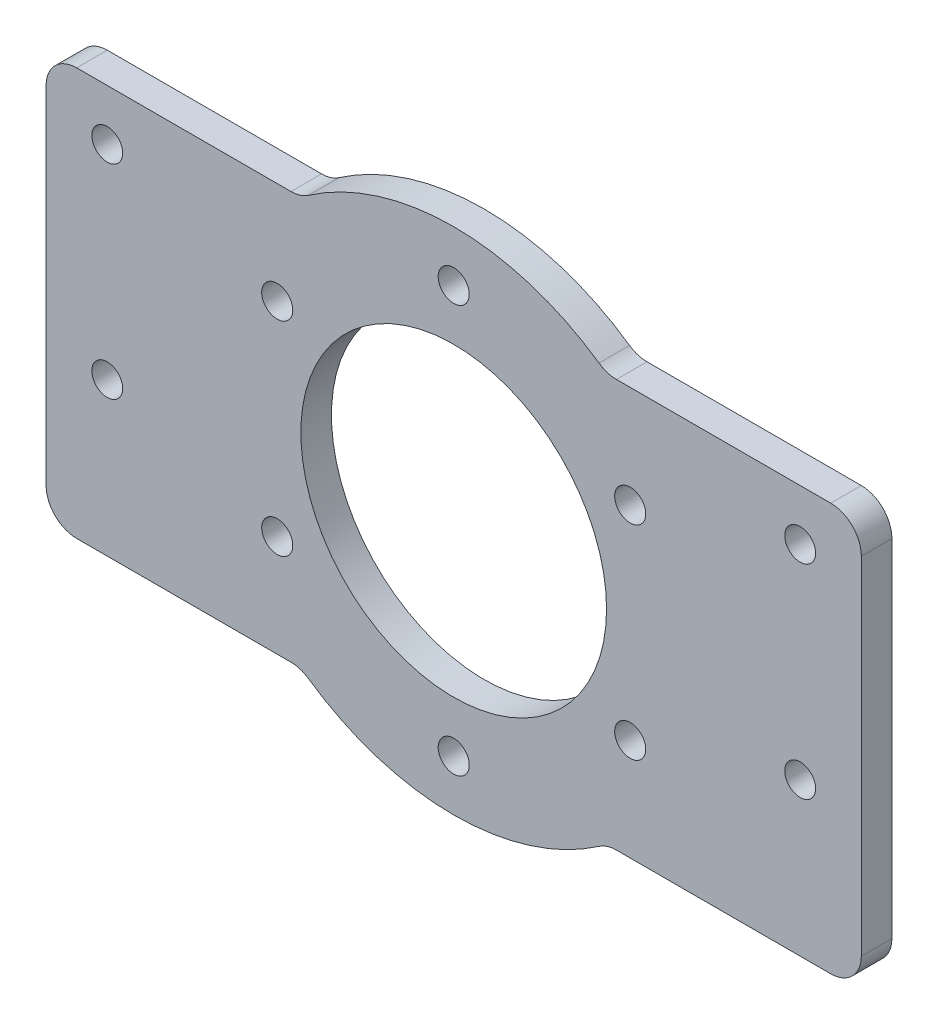
ISO-10303-21;
HEADER;
FILE_DESCRIPTION(('STEP AP214'),'2;1');
FILE_NAME('part.step','',(''),(''),'','','');
FILE_SCHEMA(('AUTOMOTIVE_DESIGN { 1 0 10303 214 1 1 1 1 }'));
ENDSEC;
DATA;
#1=APPLICATION_CONTEXT('core data for automotive mechanical design processes');
#2=APPLICATION_PROTOCOL_DEFINITION('international standard','automotive_design',2000,#1);
#3=PRODUCT_CONTEXT('',#1,'mechanical');
#4=PRODUCT('Part','Part','',(#3));
#5=PRODUCT_RELATED_PRODUCT_CATEGORY('part','',(#4));
#6=PRODUCT_DEFINITION_FORMATION('','',#4);
#7=PRODUCT_DEFINITION_CONTEXT('part definition',#1,'design');
#8=PRODUCT_DEFINITION('design','',#6,#7);
#9=PRODUCT_DEFINITION_SHAPE('','',#8);
#10=(LENGTH_UNIT() NAMED_UNIT(*) SI_UNIT(.MILLI.,.METRE.));
#11=(NAMED_UNIT(*) PLANE_ANGLE_UNIT() SI_UNIT($,.RADIAN.));
#12=(NAMED_UNIT(*) SI_UNIT($,.STERADIAN.) SOLID_ANGLE_UNIT());
#13=UNCERTAINTY_MEASURE_WITH_UNIT(LENGTH_MEASURE(1.E-05),#10,'distance_accuracy_value','');
#14=(GEOMETRIC_REPRESENTATION_CONTEXT(3) GLOBAL_UNCERTAINTY_ASSIGNED_CONTEXT((#13)) GLOBAL_UNIT_ASSIGNED_CONTEXT((#10,
#11,#12)) REPRESENTATION_CONTEXT('',''));
#15=CARTESIAN_POINT('',(0.,0.,0.));
#16=DIRECTION('',(0.,0.,1.));
#17=DIRECTION('',(1.,0.,0.));
#18=AXIS2_PLACEMENT_3D('',#15,#16,#17);
#19=CARTESIAN_POINT('',(0.,0.,3.));
#20=DIRECTION('',(0.,0.,-1.));
#21=DIRECTION('',(-1.,0.,0.));
#22=AXIS2_PLACEMENT_3D('',#19,#20,#21);
#23=CYLINDRICAL_SURFACE('',#22,25.);
#24=CARTESIAN_POINT('',(0.,0.,0.));
#25=DIRECTION('',(0.,0.,1.));
#26=DIRECTION('',(1.,0.,0.));
#27=AXIS2_PLACEMENT_3D('',#24,#25,#26);
#28=CIRCLE('',#27,25.);
#29=CARTESIAN_POINT('',(14.2577851988137,20.5357142857143,0.));
#30=VERTEX_POINT('',#29);
#31=CARTESIAN_POINT('',(-14.2577851988137,20.5357142857143,0.));
#32=VERTEX_POINT('',#31);
#33=EDGE_CURVE('E154',#30,#32,#28,.T.);
#34=ORIENTED_EDGE('',*,*,#33,.T.);
#35=DIRECTION('',(0.,0.,-1.));
#36=VECTOR('',#35,1.);
#37=CARTESIAN_POINT('',(-14.2577851988137,20.5357142857143,3.));
#38=LINE('',#37,#36);
#39=CARTESIAN_POINT('',(-14.2577851988137,20.5357142857143,3.));
#40=VERTEX_POINT('',#39);
#41=EDGE_CURVE('E160',#32,#40,#38,.F.);
#42=ORIENTED_EDGE('',*,*,#41,.T.);
#43=CARTESIAN_POINT('',(0.,0.,3.));
#44=DIRECTION('',(0.,0.,1.));
#45=DIRECTION('',(1.,0.,0.));
#46=AXIS2_PLACEMENT_3D('',#43,#44,#45);
#47=CIRCLE('',#46,25.);
#48=CARTESIAN_POINT('',(14.2577851988137,20.5357142857143,3.));
#49=VERTEX_POINT('',#48);
#50=EDGE_CURVE('E157',#49,#40,#47,.T.);
#51=ORIENTED_EDGE('',*,*,#50,.F.);
#52=DIRECTION('',(0.,0.,-1.));
#53=VECTOR('',#52,1.);
#54=CARTESIAN_POINT('',(14.2577851988137,20.5357142857143,3.));
#55=LINE('',#54,#53);
#56=EDGE_CURVE('E151',#49,#30,#55,.T.);
#57=ORIENTED_EDGE('',*,*,#56,.T.);
#58=EDGE_LOOP('',(#34,#42,#51,#57));
#59=FACE_BOUND('',#58,.T.);
#60=ADVANCED_FACE('F35',(#59),#23,.T.);
#61=CARTESIAN_POINT('',(0.,0.,3.));
#62=DIRECTION('',(0.,0.,1.));
#63=DIRECTION('',(1.,0.,0.));
#64=AXIS2_PLACEMENT_3D('',#61,#62,#63);
#65=PLANE('',#64);
#66=CARTESIAN_POINT('',(34.,15.,3.));
#67=DIRECTION('',(0.,0.,1.));
#68=DIRECTION('',(-1.,0.,0.));
#69=AXIS2_PLACEMENT_3D('',#66,#67,#68);
#70=CIRCLE('',#69,1.51499999999942);
#71=CARTESIAN_POINT('',(32.4850000000006,15.,3.));
#72=VERTEX_POINT('',#71);
#73=EDGE_CURVE('E582',#72,#72,#70,.T.);
#74=ORIENTED_EDGE('',*,*,#73,.F.);
#75=EDGE_LOOP('',(#74));
#76=FACE_BOUND('',#75,.T.);
#77=CARTESIAN_POINT('',(34.,-5.,3.));
#78=DIRECTION('',(0.,0.,1.));
#79=DIRECTION('',(-1.,0.,0.));
#80=AXIS2_PLACEMENT_3D('',#77,#78,#79);
#81=CIRCLE('',#80,1.51499999999942);
#82=CARTESIAN_POINT('',(32.4850000000006,-5.,3.));
#83=VERTEX_POINT('',#82);
#84=EDGE_CURVE('E583',#83,#83,#81,.T.);
#85=ORIENTED_EDGE('',*,*,#84,.F.);
#86=EDGE_LOOP('',(#85));
#87=FACE_BOUND('',#86,.T.);
#88=CARTESIAN_POINT('',(-34.,-5.,3.));
#89=DIRECTION('',(0.,0.,1.));
#90=DIRECTION('',(1.,0.,0.));
#91=AXIS2_PLACEMENT_3D('',#88,#89,#90);
#92=CIRCLE('',#91,1.51499999999942);
#93=CARTESIAN_POINT('',(-32.4850000000006,-5.,3.));
#94=VERTEX_POINT('',#93);
#95=EDGE_CURVE('E586',#94,#94,#92,.T.);
#96=ORIENTED_EDGE('',*,*,#95,.F.);
#97=EDGE_LOOP('',(#96));
#98=FACE_BOUND('',#97,.T.);
#99=CARTESIAN_POINT('',(-34.,15.,3.));
#100=DIRECTION('',(0.,0.,1.));
#101=DIRECTION('',(1.,0.,0.));
#102=AXIS2_PLACEMENT_3D('',#99,#100,#101);
#103=CIRCLE('',#102,1.51499999999942);
#104=CARTESIAN_POINT('',(-32.4850000000006,15.,3.));
#105=VERTEX_POINT('',#104);
#106=EDGE_CURVE('E189',#105,#105,#103,.T.);
#107=ORIENTED_EDGE('',*,*,#106,.F.);
#108=EDGE_LOOP('',(#107));
#109=FACE_BOUND('',#108,.T.);
#110=CARTESIAN_POINT('',(-17.3205080756888,9.99999999999998,3.));
#111=DIRECTION('',(0.,0.,1.));
#112=DIRECTION('',(1.,0.,0.));
#113=AXIS2_PLACEMENT_3D('',#110,#111,#112);
#114=CIRCLE('',#113,1.525);
#115=CARTESIAN_POINT('',(-15.7955080756888,9.99999999999998,3.));
#116=VERTEX_POINT('',#115);
#117=EDGE_CURVE('E240',#116,#116,#114,.T.);
#118=ORIENTED_EDGE('',*,*,#117,.F.);
#119=EDGE_LOOP('',(#118));
#120=FACE_BOUND('',#119,.T.);
#121=CARTESIAN_POINT('',(17.3205080756888,-9.99999999999999,3.));
#122=DIRECTION('',(0.,0.,1.));
#123=DIRECTION('',(1.,0.,0.));
#124=AXIS2_PLACEMENT_3D('',#121,#122,#123);
#125=CIRCLE('',#124,1.525);
#126=CARTESIAN_POINT('',(18.8455080756888,-9.99999999999999,3.));
#127=VERTEX_POINT('',#126);
#128=EDGE_CURVE('E252',#127,#127,#125,.T.);
#129=ORIENTED_EDGE('',*,*,#128,.F.);
#130=EDGE_LOOP('',(#129));
#131=FACE_BOUND('',#130,.T.);
#132=CARTESIAN_POINT('',(-17.3205080756888,-10.,3.));
#133=DIRECTION('',(0.,0.,1.));
#134=DIRECTION('',(1.,0.,0.));
#135=AXIS2_PLACEMENT_3D('',#132,#133,#134);
#136=CIRCLE('',#135,1.525);
#137=CARTESIAN_POINT('',(-15.7955080756888,-10.,3.));
#138=VERTEX_POINT('',#137);
#139=EDGE_CURVE('E264',#138,#138,#136,.T.);
#140=ORIENTED_EDGE('',*,*,#139,.F.);
#141=EDGE_LOOP('',(#140));
#142=FACE_BOUND('',#141,.T.);
#143=DIRECTION('',(-1.,0.,0.));
#144=VECTOR('',#143,1.);
#145=CARTESIAN_POINT('',(-40.,20.,3.));
#146=LINE('',#145,#144);
#147=CARTESIAN_POINT('',(-15.9687194226713,20.,3.));
#148=VERTEX_POINT('',#147);
#149=CARTESIAN_POINT('',(-37.,20.,3.));
#150=VERTEX_POINT('',#149);
#151=EDGE_CURVE('E205',#148,#150,#146,.T.);
#152=ORIENTED_EDGE('',*,*,#151,.T.);
#153=CARTESIAN_POINT('',(-37.,17.,3.));
#154=DIRECTION('',(0.,0.,1.));
#155=DIRECTION('',(1.,0.,0.));
#156=AXIS2_PLACEMENT_3D('',#153,#154,#155);
#157=CIRCLE('',#156,3.);
#158=CARTESIAN_POINT('',(-40.,17.,3.));
#159=VERTEX_POINT('',#158);
#160=EDGE_CURVE('E290',#150,#159,#157,.T.);
#161=ORIENTED_EDGE('',*,*,#160,.T.);
#162=DIRECTION('',(0.,-1.,0.));
#163=VECTOR('',#162,1.);
#164=CARTESIAN_POINT('',(-40.,-20.,3.));
#165=LINE('',#164,#163);
#166=CARTESIAN_POINT('',(-40.,-17.,3.));
#167=VERTEX_POINT('',#166);
#168=EDGE_CURVE('E196',#159,#167,#165,.T.);
#169=ORIENTED_EDGE('',*,*,#168,.T.);
#170=CARTESIAN_POINT('',(-37.,-17.,3.));
#171=DIRECTION('',(0.,0.,1.));
#172=DIRECTION('',(1.,0.,0.));
#173=AXIS2_PLACEMENT_3D('',#170,#171,#172);
#174=CIRCLE('',#173,3.);
#175=CARTESIAN_POINT('',(-37.,-20.,3.));
#176=VERTEX_POINT('',#175);
#177=EDGE_CURVE('E284',#167,#176,#174,.T.);
#178=ORIENTED_EDGE('',*,*,#177,.T.);
#179=DIRECTION('',(1.,0.,0.));
#180=VECTOR('',#179,1.);
#181=CARTESIAN_POINT('',(-40.,-20.,3.));
#182=LINE('',#181,#180);
#183=CARTESIAN_POINT('',(-15.9687194226713,-20.,3.));
#184=VERTEX_POINT('',#183);
#185=EDGE_CURVE('E200',#176,#184,#182,.T.);
#186=ORIENTED_EDGE('',*,*,#185,.T.);
#187=CARTESIAN_POINT('',(-15.9687194226713,-23.,3.));
#188=DIRECTION('',(0.,0.,1.));
#189=DIRECTION('',(1.,0.,0.));
#190=AXIS2_PLACEMENT_3D('',#187,#188,#189);
#191=CIRCLE('',#190,3.);
#192=CARTESIAN_POINT('',(-14.2577851988137,-20.5357142857143,3.));
#193=VERTEX_POINT('',#192);
#194=EDGE_CURVE('E44',#184,#193,#191,.F.);
#195=ORIENTED_EDGE('',*,*,#194,.T.);
#196=CARTESIAN_POINT('',(14.2577851988137,-20.5357142857143,3.));
#197=VERTEX_POINT('',#196);
#198=EDGE_CURVE('E171',#193,#197,#47,.T.);
#199=ORIENTED_EDGE('',*,*,#198,.T.);
#200=CARTESIAN_POINT('',(15.9687194226713,-23.,3.));
#201=DIRECTION('',(0.,0.,1.));
#202=DIRECTION('',(1.,0.,0.));
#203=AXIS2_PLACEMENT_3D('',#200,#201,#202);
#204=CIRCLE('',#203,3.);
#205=CARTESIAN_POINT('',(15.9687194226713,-20.,3.));
#206=VERTEX_POINT('',#205);
#207=EDGE_CURVE('E330',#197,#206,#204,.F.);
#208=ORIENTED_EDGE('',*,*,#207,.T.);
#209=DIRECTION('',(1.,0.,0.));
#210=VECTOR('',#209,1.);
#211=CARTESIAN_POINT('',(15.,-20.,3.));
#212=LINE('',#211,#210);
#213=CARTESIAN_POINT('',(37.,-20.,3.));
#214=VERTEX_POINT('',#213);
#215=EDGE_CURVE('E221',#206,#214,#212,.T.);
#216=ORIENTED_EDGE('',*,*,#215,.T.);
#217=CARTESIAN_POINT('',(37.,-17.,3.));
#218=DIRECTION('',(0.,0.,1.));
#219=DIRECTION('',(1.,0.,0.));
#220=AXIS2_PLACEMENT_3D('',#217,#218,#219);
#221=CIRCLE('',#220,3.);
#222=CARTESIAN_POINT('',(40.,-17.,3.));
#223=VERTEX_POINT('',#222);
#224=EDGE_CURVE('E288',#214,#223,#221,.T.);
#225=ORIENTED_EDGE('',*,*,#224,.T.);
#226=DIRECTION('',(0.,1.,0.));
#227=VECTOR('',#226,1.);
#228=CARTESIAN_POINT('',(40.,-20.,3.));
#229=LINE('',#228,#227);
#230=CARTESIAN_POINT('',(40.,17.,3.));
#231=VERTEX_POINT('',#230);
#232=EDGE_CURVE('E216',#223,#231,#229,.T.);
#233=ORIENTED_EDGE('',*,*,#232,.T.);
#234=CARTESIAN_POINT('',(37.,17.,3.));
#235=DIRECTION('',(0.,0.,1.));
#236=DIRECTION('',(1.,0.,0.));
#237=AXIS2_PLACEMENT_3D('',#234,#235,#236);
#238=CIRCLE('',#237,3.);
#239=CARTESIAN_POINT('',(37.,20.,3.));
#240=VERTEX_POINT('',#239);
#241=EDGE_CURVE('E286',#231,#240,#238,.T.);
#242=ORIENTED_EDGE('',*,*,#241,.T.);
#243=DIRECTION('',(-1.,0.,0.));
#244=VECTOR('',#243,1.);
#245=CARTESIAN_POINT('',(15.,20.,3.));
#246=LINE('',#245,#244);
#247=CARTESIAN_POINT('',(15.9687194226713,20.,3.));
#248=VERTEX_POINT('',#247);
#249=EDGE_CURVE('E227',#240,#248,#246,.T.);
#250=ORIENTED_EDGE('',*,*,#249,.T.);
#251=CARTESIAN_POINT('',(15.9687194226713,23.,3.));
#252=DIRECTION('',(0.,0.,1.));
#253=DIRECTION('',(1.,0.,0.));
#254=AXIS2_PLACEMENT_3D('',#251,#252,#253);
#255=CIRCLE('',#254,3.);
#256=EDGE_CURVE('E178',#248,#49,#255,.F.);
#257=ORIENTED_EDGE('',*,*,#256,.T.);
#258=ORIENTED_EDGE('',*,*,#50,.T.);
#259=CARTESIAN_POINT('',(-15.9687194226713,23.,3.));
#260=DIRECTION('',(0.,0.,1.));
#261=DIRECTION('',(1.,0.,0.));
#262=AXIS2_PLACEMENT_3D('',#259,#260,#261);
#263=CIRCLE('',#262,3.);
#264=EDGE_CURVE('E327',#40,#148,#263,.F.);
#265=ORIENTED_EDGE('',*,*,#264,.T.);
#266=EDGE_LOOP('',(#152,#161,#169,#178,#186,#195,#199,#208,#216,#225,#233,#242,#250,#257,#258,#265));
#267=FACE_BOUND('',#266,.T.);
#268=CARTESIAN_POINT('',(0.,20.,3.));
#269=DIRECTION('',(0.,0.,1.));
#270=DIRECTION('',(1.,0.,0.));
#271=AXIS2_PLACEMENT_3D('',#268,#269,#270);
#272=CIRCLE('',#271,1.525);
#273=CARTESIAN_POINT('',(1.525,20.,3.));
#274=VERTEX_POINT('',#273);
#275=EDGE_CURVE('E270',#274,#274,#272,.T.);
#276=ORIENTED_EDGE('',*,*,#275,.F.);
#277=EDGE_LOOP('',(#276));
#278=FACE_BOUND('',#277,.T.);
#279=CARTESIAN_POINT('',(17.3205080756888,10.,3.));
#280=DIRECTION('',(0.,0.,1.));
#281=DIRECTION('',(1.,0.,0.));
#282=AXIS2_PLACEMENT_3D('',#279,#280,#281);
#283=CIRCLE('',#282,1.525);
#284=CARTESIAN_POINT('',(18.8455080756888,10.,3.));
#285=VERTEX_POINT('',#284);
#286=EDGE_CURVE('E258',#285,#285,#283,.T.);
#287=ORIENTED_EDGE('',*,*,#286,.F.);
#288=EDGE_LOOP('',(#287));
#289=FACE_BOUND('',#288,.T.);
#290=CARTESIAN_POINT('',(0.,-20.,3.));
#291=DIRECTION('',(0.,0.,1.));
#292=DIRECTION('',(1.,0.,0.));
#293=AXIS2_PLACEMENT_3D('',#290,#291,#292);
#294=CIRCLE('',#293,1.525);
#295=CARTESIAN_POINT('',(1.525,-20.,3.));
#296=VERTEX_POINT('',#295);
#297=EDGE_CURVE('E246',#296,#296,#294,.T.);
#298=ORIENTED_EDGE('',*,*,#297,.F.);
#299=EDGE_LOOP('',(#298));
#300=FACE_BOUND('',#299,.T.);
#301=CARTESIAN_POINT('',(0.,0.,3.));
#302=DIRECTION('',(0.,0.,1.));
#303=DIRECTION('',(1.,0.,0.));
#304=AXIS2_PLACEMENT_3D('',#301,#302,#303);
#305=CIRCLE('',#304,15.);
#306=CARTESIAN_POINT('',(15.,0.,3.));
#307=VERTEX_POINT('',#306);
#308=EDGE_CURVE('E234',#307,#307,#305,.T.);
#309=ORIENTED_EDGE('',*,*,#308,.F.);
#310=EDGE_LOOP('',(#309));
#311=FACE_BOUND('',#310,.T.);
#312=ADVANCED_FACE('F342',(#76,#87,#98,#109,#120,#131,#142,#267,#278,#289,#300,#311),#65,.T.);
#313=CARTESIAN_POINT('',(0.,0.,0.));
#314=DIRECTION('',(0.,0.,1.));
#315=DIRECTION('',(1.,0.,0.));
#316=AXIS2_PLACEMENT_3D('',#313,#314,#315);
#317=PLANE('',#316);
#318=CARTESIAN_POINT('',(34.,15.,0.));
#319=DIRECTION('',(0.,0.,1.));
#320=DIRECTION('',(1.,0.,0.));
#321=AXIS2_PLACEMENT_3D('',#318,#319,#320);
#322=CIRCLE('',#321,1.51499999999942);
#323=CARTESIAN_POINT('',(35.5149999999994,15.,0.));
#324=VERTEX_POINT('',#323);
#325=EDGE_CURVE('E39',#324,#324,#322,.T.);
#326=ORIENTED_EDGE('',*,*,#325,.T.);
#327=EDGE_LOOP('',(#326));
#328=FACE_BOUND('',#327,.T.);
#329=CARTESIAN_POINT('',(34.,-5.,0.));
#330=DIRECTION('',(0.,0.,1.));
#331=DIRECTION('',(1.,0.,0.));
#332=AXIS2_PLACEMENT_3D('',#329,#330,#331);
#333=CIRCLE('',#332,1.51499999999942);
#334=CARTESIAN_POINT('',(35.5149999999994,-5.,0.));
#335=VERTEX_POINT('',#334);
#336=EDGE_CURVE('E191',#335,#335,#333,.T.);
#337=ORIENTED_EDGE('',*,*,#336,.T.);
#338=EDGE_LOOP('',(#337));
#339=FACE_BOUND('',#338,.T.);
#340=CARTESIAN_POINT('',(-34.,-5.,0.));
#341=DIRECTION('',(0.,0.,1.));
#342=DIRECTION('',(1.,0.,0.));
#343=AXIS2_PLACEMENT_3D('',#340,#341,#342);
#344=CIRCLE('',#343,1.51499999999942);
#345=CARTESIAN_POINT('',(-32.4850000000006,-5.,0.));
#346=VERTEX_POINT('',#345);
#347=EDGE_CURVE('E188',#346,#346,#344,.T.);
#348=ORIENTED_EDGE('',*,*,#347,.T.);
#349=EDGE_LOOP('',(#348));
#350=FACE_BOUND('',#349,.T.);
#351=CARTESIAN_POINT('',(-34.,15.,0.));
#352=DIRECTION('',(0.,0.,1.));
#353=DIRECTION('',(1.,0.,0.));
#354=AXIS2_PLACEMENT_3D('',#351,#352,#353);
#355=CIRCLE('',#354,1.51499999999942);
#356=CARTESIAN_POINT('',(-32.4850000000006,15.,0.));
#357=VERTEX_POINT('',#356);
#358=EDGE_CURVE('E185',#357,#357,#355,.T.);
#359=ORIENTED_EDGE('',*,*,#358,.T.);
#360=EDGE_LOOP('',(#359));
#361=FACE_BOUND('',#360,.T.);
#362=DIRECTION('',(0.,1.,0.));
#363=VECTOR('',#362,1.);
#364=CARTESIAN_POINT('',(-40.,-20.,0.));
#365=LINE('',#364,#363);
#366=CARTESIAN_POINT('',(-40.,-17.,0.));
#367=VERTEX_POINT('',#366);
#368=CARTESIAN_POINT('',(-40.,17.,0.));
#369=VERTEX_POINT('',#368);
#370=EDGE_CURVE('E208',#367,#369,#365,.T.);
#371=ORIENTED_EDGE('',*,*,#370,.T.);
#372=CARTESIAN_POINT('',(-37.,17.,0.));
#373=DIRECTION('',(0.,0.,1.));
#374=DIRECTION('',(1.,0.,0.));
#375=AXIS2_PLACEMENT_3D('',#372,#373,#374);
#376=CIRCLE('',#375,3.);
#377=CARTESIAN_POINT('',(-37.,20.,0.));
#378=VERTEX_POINT('',#377);
#379=EDGE_CURVE('E303',#369,#378,#376,.F.);
#380=ORIENTED_EDGE('',*,*,#379,.T.);
#381=DIRECTION('',(1.,0.,0.));
#382=VECTOR('',#381,1.);
#383=CARTESIAN_POINT('',(-40.,20.,0.));
#384=LINE('',#383,#382);
#385=CARTESIAN_POINT('',(-15.9687194226713,20.,0.));
#386=VERTEX_POINT('',#385);
#387=EDGE_CURVE('E213',#378,#386,#384,.T.);
#388=ORIENTED_EDGE('',*,*,#387,.T.);
#389=CARTESIAN_POINT('',(-15.9687194226713,23.,0.));
#390=DIRECTION('',(0.,0.,1.));
#391=DIRECTION('',(1.,0.,0.));
#392=AXIS2_PLACEMENT_3D('',#389,#390,#391);
#393=CIRCLE('',#392,3.);
#394=EDGE_CURVE('E170',#386,#32,#393,.T.);
#395=ORIENTED_EDGE('',*,*,#394,.T.);
#396=ORIENTED_EDGE('',*,*,#33,.F.);
#397=CARTESIAN_POINT('',(15.9687194226713,23.,0.));
#398=DIRECTION('',(0.,0.,1.));
#399=DIRECTION('',(1.,0.,0.));
#400=AXIS2_PLACEMENT_3D('',#397,#398,#399);
#401=CIRCLE('',#400,3.);
#402=CARTESIAN_POINT('',(15.9687194226713,20.,0.));
#403=VERTEX_POINT('',#402);
#404=EDGE_CURVE('E166',#30,#403,#401,.T.);
#405=ORIENTED_EDGE('',*,*,#404,.T.);
#406=DIRECTION('',(1.,0.,0.));
#407=VECTOR('',#406,1.);
#408=CARTESIAN_POINT('',(15.,20.,0.));
#409=LINE('',#408,#407);
#410=CARTESIAN_POINT('',(37.,20.,0.));
#411=VERTEX_POINT('',#410);
#412=EDGE_CURVE('E224',#403,#411,#409,.T.);
#413=ORIENTED_EDGE('',*,*,#412,.T.);
#414=CARTESIAN_POINT('',(37.,17.,0.));
#415=DIRECTION('',(0.,0.,1.));
#416=DIRECTION('',(1.,0.,0.));
#417=AXIS2_PLACEMENT_3D('',#414,#415,#416);
#418=CIRCLE('',#417,3.);
#419=CARTESIAN_POINT('',(40.,17.,0.));
#420=VERTEX_POINT('',#419);
#421=EDGE_CURVE('E299',#411,#420,#418,.F.);
#422=ORIENTED_EDGE('',*,*,#421,.T.);
#423=DIRECTION('',(0.,-1.,0.));
#424=VECTOR('',#423,1.);
#425=CARTESIAN_POINT('',(40.,-20.,0.));
#426=LINE('',#425,#424);
#427=CARTESIAN_POINT('',(40.,-17.,0.));
#428=VERTEX_POINT('',#427);
#429=EDGE_CURVE('E220',#420,#428,#426,.T.);
#430=ORIENTED_EDGE('',*,*,#429,.T.);
#431=CARTESIAN_POINT('',(37.,-17.,0.));
#432=DIRECTION('',(0.,0.,1.));
#433=DIRECTION('',(1.,0.,0.));
#434=AXIS2_PLACEMENT_3D('',#431,#432,#433);
#435=CIRCLE('',#434,3.);
#436=CARTESIAN_POINT('',(37.,-20.,0.));
#437=VERTEX_POINT('',#436);
#438=EDGE_CURVE('E301',#428,#437,#435,.F.);
#439=ORIENTED_EDGE('',*,*,#438,.T.);
#440=DIRECTION('',(-1.,0.,0.));
#441=VECTOR('',#440,1.);
#442=CARTESIAN_POINT('',(15.,-20.,0.));
#443=LINE('',#442,#441);
#444=CARTESIAN_POINT('',(15.9687194226713,-20.,0.));
#445=VERTEX_POINT('',#444);
#446=EDGE_CURVE('E217',#437,#445,#443,.T.);
#447=ORIENTED_EDGE('',*,*,#446,.T.);
#448=CARTESIAN_POINT('',(15.9687194226713,-23.,0.));
#449=DIRECTION('',(0.,0.,1.));
#450=DIRECTION('',(1.,0.,0.));
#451=AXIS2_PLACEMENT_3D('',#448,#449,#450);
#452=CIRCLE('',#451,3.);
#453=CARTESIAN_POINT('',(14.2577851988137,-20.5357142857143,0.));
#454=VERTEX_POINT('',#453);
#455=EDGE_CURVE('E181',#445,#454,#452,.T.);
#456=ORIENTED_EDGE('',*,*,#455,.T.);
#457=CARTESIAN_POINT('',(-14.2577851988137,-20.5357142857143,0.));
#458=VERTEX_POINT('',#457);
#459=EDGE_CURVE('E172',#458,#454,#28,.T.);
#460=ORIENTED_EDGE('',*,*,#459,.F.);
#461=CARTESIAN_POINT('',(-15.9687194226713,-23.,0.));
#462=DIRECTION('',(0.,0.,1.));
#463=DIRECTION('',(1.,0.,0.));
#464=AXIS2_PLACEMENT_3D('',#461,#462,#463);
#465=CIRCLE('',#464,3.);
#466=CARTESIAN_POINT('',(-15.9687194226713,-20.,0.));
#467=VERTEX_POINT('',#466);
#468=EDGE_CURVE('E11',#458,#467,#465,.T.);
#469=ORIENTED_EDGE('',*,*,#468,.T.);
#470=DIRECTION('',(-1.,0.,0.));
#471=VECTOR('',#470,1.);
#472=CARTESIAN_POINT('',(-40.,-20.,0.));
#473=LINE('',#472,#471);
#474=CARTESIAN_POINT('',(-37.,-20.,0.));
#475=VERTEX_POINT('',#474);
#476=EDGE_CURVE('E214',#467,#475,#473,.T.);
#477=ORIENTED_EDGE('',*,*,#476,.T.);
#478=CARTESIAN_POINT('',(-37.,-17.,0.));
#479=DIRECTION('',(0.,0.,1.));
#480=DIRECTION('',(1.,0.,0.));
#481=AXIS2_PLACEMENT_3D('',#478,#479,#480);
#482=CIRCLE('',#481,3.);
#483=EDGE_CURVE('E297',#475,#367,#482,.F.);
#484=ORIENTED_EDGE('',*,*,#483,.T.);
#485=EDGE_LOOP('',(#371,#380,#388,#395,#396,#405,#413,#422,#430,#439,#447,#456,#460,#469,#477,#484));
#486=FACE_BOUND('',#485,.T.);
#487=CARTESIAN_POINT('',(0.,20.,0.));
#488=DIRECTION('',(0.,0.,1.));
#489=DIRECTION('',(1.,0.,0.));
#490=AXIS2_PLACEMENT_3D('',#487,#488,#489);
#491=CIRCLE('',#490,1.525);
#492=CARTESIAN_POINT('',(1.525,20.,0.));
#493=VERTEX_POINT('',#492);
#494=EDGE_CURVE('E267',#493,#493,#491,.T.);
#495=ORIENTED_EDGE('',*,*,#494,.T.);
#496=EDGE_LOOP('',(#495));
#497=FACE_BOUND('',#496,.T.);
#498=CARTESIAN_POINT('',(-17.3205080756888,-10.,0.));
#499=DIRECTION('',(0.,0.,1.));
#500=DIRECTION('',(1.,0.,0.));
#501=AXIS2_PLACEMENT_3D('',#498,#499,#500);
#502=CIRCLE('',#501,1.525);
#503=CARTESIAN_POINT('',(-15.7955080756888,-10.,0.));
#504=VERTEX_POINT('',#503);
#505=EDGE_CURVE('E261',#504,#504,#502,.T.);
#506=ORIENTED_EDGE('',*,*,#505,.T.);
#507=EDGE_LOOP('',(#506));
#508=FACE_BOUND('',#507,.T.);
#509=CARTESIAN_POINT('',(17.3205080756888,10.,0.));
#510=DIRECTION('',(0.,0.,1.));
#511=DIRECTION('',(1.,0.,0.));
#512=AXIS2_PLACEMENT_3D('',#509,#510,#511);
#513=CIRCLE('',#512,1.525);
#514=CARTESIAN_POINT('',(18.8455080756888,10.,0.));
#515=VERTEX_POINT('',#514);
#516=EDGE_CURVE('E255',#515,#515,#513,.T.);
#517=ORIENTED_EDGE('',*,*,#516,.T.);
#518=EDGE_LOOP('',(#517));
#519=FACE_BOUND('',#518,.T.);
#520=CARTESIAN_POINT('',(17.3205080756888,-9.99999999999999,0.));
#521=DIRECTION('',(0.,0.,1.));
#522=DIRECTION('',(1.,0.,0.));
#523=AXIS2_PLACEMENT_3D('',#520,#521,#522);
#524=CIRCLE('',#523,1.525);
#525=CARTESIAN_POINT('',(18.8455080756888,-9.99999999999999,0.));
#526=VERTEX_POINT('',#525);
#527=EDGE_CURVE('E249',#526,#526,#524,.T.);
#528=ORIENTED_EDGE('',*,*,#527,.T.);
#529=EDGE_LOOP('',(#528));
#530=FACE_BOUND('',#529,.T.);
#531=CARTESIAN_POINT('',(0.,-20.,0.));
#532=DIRECTION('',(0.,0.,1.));
#533=DIRECTION('',(1.,0.,0.));
#534=AXIS2_PLACEMENT_3D('',#531,#532,#533);
#535=CIRCLE('',#534,1.525);
#536=CARTESIAN_POINT('',(1.525,-20.,0.));
#537=VERTEX_POINT('',#536);
#538=EDGE_CURVE('E243',#537,#537,#535,.T.);
#539=ORIENTED_EDGE('',*,*,#538,.T.);
#540=EDGE_LOOP('',(#539));
#541=FACE_BOUND('',#540,.T.);
#542=CARTESIAN_POINT('',(-17.3205080756888,9.99999999999998,0.));
#543=DIRECTION('',(0.,0.,1.));
#544=DIRECTION('',(1.,0.,0.));
#545=AXIS2_PLACEMENT_3D('',#542,#543,#544);
#546=CIRCLE('',#545,1.525);
#547=CARTESIAN_POINT('',(-15.7955080756888,9.99999999999998,0.));
#548=VERTEX_POINT('',#547);
#549=EDGE_CURVE('E237',#548,#548,#546,.T.);
#550=ORIENTED_EDGE('',*,*,#549,.T.);
#551=EDGE_LOOP('',(#550));
#552=FACE_BOUND('',#551,.T.);
#553=CARTESIAN_POINT('',(0.,0.,0.));
#554=DIRECTION('',(0.,0.,1.));
#555=DIRECTION('',(1.,0.,0.));
#556=AXIS2_PLACEMENT_3D('',#553,#554,#555);
#557=CIRCLE('',#556,15.);
#558=CARTESIAN_POINT('',(15.,0.,0.));
#559=VERTEX_POINT('',#558);
#560=EDGE_CURVE('E233',#559,#559,#557,.T.);
#561=ORIENTED_EDGE('',*,*,#560,.T.);
#562=EDGE_LOOP('',(#561));
#563=FACE_BOUND('',#562,.T.);
#564=ADVANCED_FACE('F163',(#328,#339,#350,#361,#486,#497,#508,#519,#530,#541,#552,#563),#317,.F.);
#565=ORIENTED_EDGE('',*,*,#459,.T.);
#566=DIRECTION('',(0.,0.,-1.));
#567=VECTOR('',#566,1.);
#568=CARTESIAN_POINT('',(14.2577851988137,-20.5357142857143,3.));
#569=LINE('',#568,#567);
#570=EDGE_CURVE('E307',#454,#197,#569,.F.);
#571=ORIENTED_EDGE('',*,*,#570,.T.);
#572=ORIENTED_EDGE('',*,*,#198,.F.);
#573=DIRECTION('',(0.,0.,-1.));
#574=VECTOR('',#573,1.);
#575=CARTESIAN_POINT('',(-14.2577851988137,-20.5357142857143,3.));
#576=LINE('',#575,#574);
#577=EDGE_CURVE('E305',#193,#458,#576,.T.);
#578=ORIENTED_EDGE('',*,*,#577,.T.);
#579=EDGE_LOOP('',(#565,#571,#572,#578));
#580=FACE_BOUND('',#579,.T.);
#581=ADVANCED_FACE('F337',(#580),#23,.T.);
#582=CARTESIAN_POINT('',(0.,20.,3.));
#583=DIRECTION('',(0.,0.,-1.));
#584=DIRECTION('',(-1.,0.,0.));
#585=AXIS2_PLACEMENT_3D('',#582,#583,#584);
#586=CYLINDRICAL_SURFACE('',#585,1.525);
#587=ORIENTED_EDGE('',*,*,#275,.T.);
#588=EDGE_LOOP('',(#587));
#589=FACE_BOUND('',#588,.T.);
#590=ORIENTED_EDGE('',*,*,#494,.F.);
#591=EDGE_LOOP('',(#590));
#592=FACE_BOUND('',#591,.T.);
#593=ADVANCED_FACE('F386',(#589,#592),#586,.F.);
#594=CARTESIAN_POINT('',(-17.3205080756888,-10.,3.));
#595=DIRECTION('',(0.,0.,-1.));
#596=DIRECTION('',(-1.,0.,0.));
#597=AXIS2_PLACEMENT_3D('',#594,#595,#596);
#598=CYLINDRICAL_SURFACE('',#597,1.525);
#599=ORIENTED_EDGE('',*,*,#139,.T.);
#600=EDGE_LOOP('',(#599));
#601=FACE_BOUND('',#600,.T.);
#602=ORIENTED_EDGE('',*,*,#505,.F.);
#603=EDGE_LOOP('',(#602));
#604=FACE_BOUND('',#603,.T.);
#605=ADVANCED_FACE('F391',(#601,#604),#598,.F.);
#606=CARTESIAN_POINT('',(17.3205080756888,10.,3.));
#607=DIRECTION('',(0.,0.,-1.));
#608=DIRECTION('',(-1.,0.,0.));
#609=AXIS2_PLACEMENT_3D('',#606,#607,#608);
#610=CYLINDRICAL_SURFACE('',#609,1.525);
#611=ORIENTED_EDGE('',*,*,#286,.T.);
#612=EDGE_LOOP('',(#611));
#613=FACE_BOUND('',#612,.T.);
#614=ORIENTED_EDGE('',*,*,#516,.F.);
#615=EDGE_LOOP('',(#614));
#616=FACE_BOUND('',#615,.T.);
#617=ADVANCED_FACE('F401',(#613,#616),#610,.F.);
#618=CARTESIAN_POINT('',(17.3205080756888,-9.99999999999999,3.));
#619=DIRECTION('',(0.,0.,-1.));
#620=DIRECTION('',(-1.,0.,0.));
#621=AXIS2_PLACEMENT_3D('',#618,#619,#620);
#622=CYLINDRICAL_SURFACE('',#621,1.525);
#623=ORIENTED_EDGE('',*,*,#128,.T.);
#624=EDGE_LOOP('',(#623));
#625=FACE_BOUND('',#624,.T.);
#626=ORIENTED_EDGE('',*,*,#527,.F.);
#627=EDGE_LOOP('',(#626));
#628=FACE_BOUND('',#627,.T.);
#629=ADVANCED_FACE('F405',(#625,#628),#622,.F.);
#630=CARTESIAN_POINT('',(0.,-20.,3.));
#631=DIRECTION('',(0.,0.,-1.));
#632=DIRECTION('',(-1.,0.,0.));
#633=AXIS2_PLACEMENT_3D('',#630,#631,#632);
#634=CYLINDRICAL_SURFACE('',#633,1.525);
#635=ORIENTED_EDGE('',*,*,#297,.T.);
#636=EDGE_LOOP('',(#635));
#637=FACE_BOUND('',#636,.T.);
#638=ORIENTED_EDGE('',*,*,#538,.F.);
#639=EDGE_LOOP('',(#638));
#640=FACE_BOUND('',#639,.T.);
#641=ADVANCED_FACE('F409',(#637,#640),#634,.F.);
#642=CARTESIAN_POINT('',(-17.3205080756888,9.99999999999998,3.));
#643=DIRECTION('',(0.,0.,-1.));
#644=DIRECTION('',(-1.,0.,0.));
#645=AXIS2_PLACEMENT_3D('',#642,#643,#644);
#646=CYLINDRICAL_SURFACE('',#645,1.525);
#647=ORIENTED_EDGE('',*,*,#117,.T.);
#648=EDGE_LOOP('',(#647));
#649=FACE_BOUND('',#648,.T.);
#650=ORIENTED_EDGE('',*,*,#549,.F.);
#651=EDGE_LOOP('',(#650));
#652=FACE_BOUND('',#651,.T.);
#653=ADVANCED_FACE('F413',(#649,#652),#646,.F.);
#654=CARTESIAN_POINT('',(0.,0.,3.));
#655=DIRECTION('',(0.,0.,-1.));
#656=DIRECTION('',(-1.,0.,0.));
#657=AXIS2_PLACEMENT_3D('',#654,#655,#656);
#658=CYLINDRICAL_SURFACE('',#657,15.);
#659=ORIENTED_EDGE('',*,*,#308,.T.);
#660=EDGE_LOOP('',(#659));
#661=FACE_BOUND('',#660,.T.);
#662=ORIENTED_EDGE('',*,*,#560,.F.);
#663=EDGE_LOOP('',(#662));
#664=FACE_BOUND('',#663,.T.);
#665=ADVANCED_FACE('F417',(#661,#664),#658,.F.);
#666=CARTESIAN_POINT('',(40.,-20.,-47.169905660283));
#667=DIRECTION('',(1.,0.,0.));
#668=DIRECTION('',(0.,0.,-1.));
#669=AXIS2_PLACEMENT_3D('',#666,#667,#668);
#670=PLANE('',#669);
#671=ORIENTED_EDGE('',*,*,#232,.F.);
#672=DIRECTION('',(0.,0.,1.));
#673=VECTOR('',#672,1.);
#674=CARTESIAN_POINT('',(40.,-17.,-47.169905660283));
#675=LINE('',#674,#673);
#676=EDGE_CURVE('E318',#223,#428,#675,.F.);
#677=ORIENTED_EDGE('',*,*,#676,.T.);
#678=ORIENTED_EDGE('',*,*,#429,.F.);
#679=DIRECTION('',(0.,0.,1.));
#680=VECTOR('',#679,1.);
#681=CARTESIAN_POINT('',(40.,17.,-47.169905660283));
#682=LINE('',#681,#680);
#683=EDGE_CURVE('E315',#420,#231,#682,.T.);
#684=ORIENTED_EDGE('',*,*,#683,.T.);
#685=EDGE_LOOP('',(#671,#677,#678,#684));
#686=FACE_BOUND('',#685,.T.);
#687=ADVANCED_FACE('F353',(#686),#670,.T.);
#688=CARTESIAN_POINT('',(15.,-20.,-47.169905660283));
#689=DIRECTION('',(0.,-1.,0.));
#690=DIRECTION('',(1.,0.,0.));
#691=AXIS2_PLACEMENT_3D('',#688,#689,#690);
#692=PLANE('',#691);
#693=ORIENTED_EDGE('',*,*,#215,.F.);
#694=DIRECTION('',(0.,0.,-1.));
#695=VECTOR('',#694,1.);
#696=CARTESIAN_POINT('',(15.9687194226713,-20.,-47.169905660283));
#697=LINE('',#696,#695);
#698=EDGE_CURVE('E313',#206,#445,#697,.T.);
#699=ORIENTED_EDGE('',*,*,#698,.T.);
#700=ORIENTED_EDGE('',*,*,#446,.F.);
#701=DIRECTION('',(0.,0.,1.));
#702=VECTOR('',#701,1.);
#703=CARTESIAN_POINT('',(37.,-20.,-47.169905660283));
#704=LINE('',#703,#702);
#705=EDGE_CURVE('E310',#437,#214,#704,.T.);
#706=ORIENTED_EDGE('',*,*,#705,.T.);
#707=EDGE_LOOP('',(#693,#699,#700,#706));
#708=FACE_BOUND('',#707,.T.);
#709=ADVANCED_FACE('F345',(#708),#692,.T.);
#710=CARTESIAN_POINT('',(15.,20.,-47.169905660283));
#711=DIRECTION('',(0.,1.,0.));
#712=DIRECTION('',(-1.,0.,0.));
#713=AXIS2_PLACEMENT_3D('',#710,#711,#712);
#714=PLANE('',#713);
#715=ORIENTED_EDGE('',*,*,#249,.F.);
#716=DIRECTION('',(0.,0.,1.));
#717=VECTOR('',#716,1.);
#718=CARTESIAN_POINT('',(37.,20.,-47.169905660283));
#719=LINE('',#718,#717);
#720=EDGE_CURVE('E321',#240,#411,#719,.F.);
#721=ORIENTED_EDGE('',*,*,#720,.T.);
#722=ORIENTED_EDGE('',*,*,#412,.F.);
#723=DIRECTION('',(0.,0.,-1.));
#724=VECTOR('',#723,1.);
#725=CARTESIAN_POINT('',(15.9687194226713,20.,-47.169905660283));
#726=LINE('',#725,#724);
#727=EDGE_CURVE('E177',#403,#248,#726,.F.);
#728=ORIENTED_EDGE('',*,*,#727,.T.);
#729=EDGE_LOOP('',(#715,#721,#722,#728));
#730=FACE_BOUND('',#729,.T.);
#731=ADVANCED_FACE('F362',(#730),#714,.T.);
#732=CARTESIAN_POINT('',(-40.,-20.,-47.169905660283));
#733=DIRECTION('',(-1.,0.,0.));
#734=DIRECTION('',(0.,0.,1.));
#735=AXIS2_PLACEMENT_3D('',#732,#733,#734);
#736=PLANE('',#735);
#737=ORIENTED_EDGE('',*,*,#168,.F.);
#738=DIRECTION('',(0.,0.,1.));
#739=VECTOR('',#738,1.);
#740=CARTESIAN_POINT('',(-40.,17.,-47.169905660283));
#741=LINE('',#740,#739);
#742=EDGE_CURVE('E295',#159,#369,#741,.F.);
#743=ORIENTED_EDGE('',*,*,#742,.T.);
#744=ORIENTED_EDGE('',*,*,#370,.F.);
#745=DIRECTION('',(0.,0.,1.));
#746=VECTOR('',#745,1.);
#747=CARTESIAN_POINT('',(-40.,-17.,-47.169905660283));
#748=LINE('',#747,#746);
#749=EDGE_CURVE('E292',#367,#167,#748,.T.);
#750=ORIENTED_EDGE('',*,*,#749,.T.);
#751=EDGE_LOOP('',(#737,#743,#744,#750));
#752=FACE_BOUND('',#751,.T.);
#753=ADVANCED_FACE('F364',(#752),#736,.T.);
#754=CARTESIAN_POINT('',(-40.,20.,-47.169905660283));
#755=DIRECTION('',(0.,1.,0.));
#756=DIRECTION('',(-1.,0.,0.));
#757=AXIS2_PLACEMENT_3D('',#754,#755,#756);
#758=PLANE('',#757);
#759=ORIENTED_EDGE('',*,*,#151,.F.);
#760=DIRECTION('',(0.,0.,-1.));
#761=VECTOR('',#760,1.);
#762=CARTESIAN_POINT('',(-15.9687194226713,20.,-47.169905660283));
#763=LINE('',#762,#761);
#764=EDGE_CURVE('E282',#148,#386,#763,.T.);
#765=ORIENTED_EDGE('',*,*,#764,.T.);
#766=ORIENTED_EDGE('',*,*,#387,.F.);
#767=DIRECTION('',(0.,0.,1.));
#768=VECTOR('',#767,1.);
#769=CARTESIAN_POINT('',(-37.,20.,-47.169905660283));
#770=LINE('',#769,#768);
#771=EDGE_CURVE('E279',#378,#150,#770,.T.);
#772=ORIENTED_EDGE('',*,*,#771,.T.);
#773=EDGE_LOOP('',(#759,#765,#766,#772));
#774=FACE_BOUND('',#773,.T.);
#775=ADVANCED_FACE('F370',(#774),#758,.T.);
#776=CARTESIAN_POINT('',(-40.,-20.,-47.169905660283));
#777=DIRECTION('',(0.,-1.,0.));
#778=DIRECTION('',(1.,0.,0.));
#779=AXIS2_PLACEMENT_3D('',#776,#777,#778);
#780=PLANE('',#779);
#781=ORIENTED_EDGE('',*,*,#476,.F.);
#782=DIRECTION('',(0.,0.,-1.));
#783=VECTOR('',#782,1.);
#784=CARTESIAN_POINT('',(-15.9687194226713,-20.,-47.169905660283));
#785=LINE('',#784,#783);
#786=EDGE_CURVE('E324',#467,#184,#785,.F.);
#787=ORIENTED_EDGE('',*,*,#786,.T.);
#788=ORIENTED_EDGE('',*,*,#185,.F.);
#789=DIRECTION('',(0.,0.,1.));
#790=VECTOR('',#789,1.);
#791=CARTESIAN_POINT('',(-37.,-20.,-47.169905660283));
#792=LINE('',#791,#790);
#793=EDGE_CURVE('E52',#176,#475,#792,.F.);
#794=ORIENTED_EDGE('',*,*,#793,.T.);
#795=EDGE_LOOP('',(#781,#787,#788,#794));
#796=FACE_BOUND('',#795,.T.);
#797=ADVANCED_FACE('F445',(#796),#780,.T.);
#798=CARTESIAN_POINT('',(-15.9687194226713,23.,3.));
#799=DIRECTION('',(0.,0.,-1.));
#800=DIRECTION('',(-1.,0.,0.));
#801=AXIS2_PLACEMENT_3D('',#798,#799,#800);
#802=CYLINDRICAL_SURFACE('',#801,3.);
#803=ORIENTED_EDGE('',*,*,#394,.F.);
#804=ORIENTED_EDGE('',*,*,#764,.F.);
#805=ORIENTED_EDGE('',*,*,#264,.F.);
#806=ORIENTED_EDGE('',*,*,#41,.F.);
#807=EDGE_LOOP('',(#803,#804,#805,#806));
#808=FACE_BOUND('',#807,.T.);
#809=ADVANCED_FACE('F455',(#808),#802,.F.);
#810=CARTESIAN_POINT('',(-37.,17.,-47.169905660283));
#811=DIRECTION('',(0.,0.,1.));
#812=DIRECTION('',(1.,0.,0.));
#813=AXIS2_PLACEMENT_3D('',#810,#811,#812);
#814=CYLINDRICAL_SURFACE('',#813,3.);
#815=ORIENTED_EDGE('',*,*,#379,.F.);
#816=ORIENTED_EDGE('',*,*,#742,.F.);
#817=ORIENTED_EDGE('',*,*,#160,.F.);
#818=ORIENTED_EDGE('',*,*,#771,.F.);
#819=EDGE_LOOP('',(#815,#816,#817,#818));
#820=FACE_BOUND('',#819,.T.);
#821=ADVANCED_FACE('F464',(#820),#814,.T.);
#822=CARTESIAN_POINT('',(15.9687194226713,-23.,3.));
#823=DIRECTION('',(0.,0.,-1.));
#824=DIRECTION('',(-1.,0.,0.));
#825=AXIS2_PLACEMENT_3D('',#822,#823,#824);
#826=CYLINDRICAL_SURFACE('',#825,3.);
#827=ORIENTED_EDGE('',*,*,#455,.F.);
#828=ORIENTED_EDGE('',*,*,#698,.F.);
#829=ORIENTED_EDGE('',*,*,#207,.F.);
#830=ORIENTED_EDGE('',*,*,#570,.F.);
#831=EDGE_LOOP('',(#827,#828,#829,#830));
#832=FACE_BOUND('',#831,.T.);
#833=ADVANCED_FACE('F340',(#832),#826,.F.);
#834=CARTESIAN_POINT('',(37.,-17.,-47.169905660283));
#835=DIRECTION('',(0.,0.,1.));
#836=DIRECTION('',(1.,0.,0.));
#837=AXIS2_PLACEMENT_3D('',#834,#835,#836);
#838=CYLINDRICAL_SURFACE('',#837,3.);
#839=ORIENTED_EDGE('',*,*,#438,.F.);
#840=ORIENTED_EDGE('',*,*,#676,.F.);
#841=ORIENTED_EDGE('',*,*,#224,.F.);
#842=ORIENTED_EDGE('',*,*,#705,.F.);
#843=EDGE_LOOP('',(#839,#840,#841,#842));
#844=FACE_BOUND('',#843,.T.);
#845=ADVANCED_FACE('F349',(#844),#838,.T.);
#846=CARTESIAN_POINT('',(37.,17.,-47.169905660283));
#847=DIRECTION('',(0.,0.,1.));
#848=DIRECTION('',(1.,0.,0.));
#849=AXIS2_PLACEMENT_3D('',#846,#847,#848);
#850=CYLINDRICAL_SURFACE('',#849,3.);
#851=ORIENTED_EDGE('',*,*,#421,.F.);
#852=ORIENTED_EDGE('',*,*,#720,.F.);
#853=ORIENTED_EDGE('',*,*,#241,.F.);
#854=ORIENTED_EDGE('',*,*,#683,.F.);
#855=EDGE_LOOP('',(#851,#852,#853,#854));
#856=FACE_BOUND('',#855,.T.);
#857=ADVANCED_FACE('F358',(#856),#850,.T.);
#858=CARTESIAN_POINT('',(15.9687194226713,23.,3.));
#859=DIRECTION('',(0.,0.,-1.));
#860=DIRECTION('',(-1.,0.,0.));
#861=AXIS2_PLACEMENT_3D('',#858,#859,#860);
#862=CYLINDRICAL_SURFACE('',#861,3.);
#863=ORIENTED_EDGE('',*,*,#404,.F.);
#864=ORIENTED_EDGE('',*,*,#56,.F.);
#865=ORIENTED_EDGE('',*,*,#256,.F.);
#866=ORIENTED_EDGE('',*,*,#727,.F.);
#867=EDGE_LOOP('',(#863,#864,#865,#866));
#868=FACE_BOUND('',#867,.T.);
#869=ADVANCED_FACE('F175',(#868),#862,.F.);
#870=CARTESIAN_POINT('',(-15.9687194226713,-23.,3.));
#871=DIRECTION('',(0.,0.,-1.));
#872=DIRECTION('',(-1.,0.,0.));
#873=AXIS2_PLACEMENT_3D('',#870,#871,#872);
#874=CYLINDRICAL_SURFACE('',#873,3.);
#875=ORIENTED_EDGE('',*,*,#468,.F.);
#876=ORIENTED_EDGE('',*,*,#577,.F.);
#877=ORIENTED_EDGE('',*,*,#194,.F.);
#878=ORIENTED_EDGE('',*,*,#786,.F.);
#879=EDGE_LOOP('',(#875,#876,#877,#878));
#880=FACE_BOUND('',#879,.T.);
#881=ADVANCED_FACE('F506',(#880),#874,.F.);
#882=CARTESIAN_POINT('',(-37.,-17.,-47.169905660283));
#883=DIRECTION('',(0.,0.,1.));
#884=DIRECTION('',(1.,0.,0.));
#885=AXIS2_PLACEMENT_3D('',#882,#883,#884);
#886=CYLINDRICAL_SURFACE('',#885,3.);
#887=ORIENTED_EDGE('',*,*,#483,.F.);
#888=ORIENTED_EDGE('',*,*,#793,.F.);
#889=ORIENTED_EDGE('',*,*,#177,.F.);
#890=ORIENTED_EDGE('',*,*,#749,.F.);
#891=EDGE_LOOP('',(#887,#888,#889,#890));
#892=FACE_BOUND('',#891,.T.);
#893=ADVANCED_FACE('F37',(#892),#886,.T.);
#894=CARTESIAN_POINT('',(-34.,15.,-7.));
#895=DIRECTION('',(0.,0.,1.));
#896=DIRECTION('',(1.,0.,0.));
#897=AXIS2_PLACEMENT_3D('',#894,#895,#896);
#898=CYLINDRICAL_SURFACE('',#897,1.51499999999942);
#899=ORIENTED_EDGE('',*,*,#106,.T.);
#900=EDGE_LOOP('',(#899));
#901=FACE_BOUND('',#900,.T.);
#902=ORIENTED_EDGE('',*,*,#358,.F.);
#903=EDGE_LOOP('',(#902));
#904=FACE_BOUND('',#903,.T.);
#905=ADVANCED_FACE('F523',(#901,#904),#898,.F.);
#906=CARTESIAN_POINT('',(-34.,-5.,-7.));
#907=DIRECTION('',(0.,0.,1.));
#908=DIRECTION('',(1.,0.,0.));
#909=AXIS2_PLACEMENT_3D('',#906,#907,#908);
#910=CYLINDRICAL_SURFACE('',#909,1.51499999999942);
#911=ORIENTED_EDGE('',*,*,#95,.T.);
#912=EDGE_LOOP('',(#911));
#913=FACE_BOUND('',#912,.T.);
#914=ORIENTED_EDGE('',*,*,#347,.F.);
#915=EDGE_LOOP('',(#914));
#916=FACE_BOUND('',#915,.T.);
#917=ADVANCED_FACE('F545',(#913,#916),#910,.F.);
#918=CARTESIAN_POINT('',(34.,-5.,-7.));
#919=DIRECTION('',(0.,0.,1.));
#920=DIRECTION('',(1.,0.,0.));
#921=AXIS2_PLACEMENT_3D('',#918,#919,#920);
#922=CYLINDRICAL_SURFACE('',#921,1.51499999999942);
#923=ORIENTED_EDGE('',*,*,#84,.T.);
#924=EDGE_LOOP('',(#923));
#925=FACE_BOUND('',#924,.T.);
#926=ORIENTED_EDGE('',*,*,#336,.F.);
#927=EDGE_LOOP('',(#926));
#928=FACE_BOUND('',#927,.T.);
#929=ADVANCED_FACE('F555',(#925,#928),#922,.F.);
#930=CARTESIAN_POINT('',(34.,15.,-7.));
#931=DIRECTION('',(0.,0.,1.));
#932=DIRECTION('',(1.,0.,0.));
#933=AXIS2_PLACEMENT_3D('',#930,#931,#932);
#934=CYLINDRICAL_SURFACE('',#933,1.51499999999942);
#935=ORIENTED_EDGE('',*,*,#73,.T.);
#936=EDGE_LOOP('',(#935));
#937=FACE_BOUND('',#936,.T.);
#938=ORIENTED_EDGE('',*,*,#325,.F.);
#939=EDGE_LOOP('',(#938));
#940=FACE_BOUND('',#939,.T.);
#941=ADVANCED_FACE('F565',(#937,#940),#934,.F.);
#942=CLOSED_SHELL('',(#60,#312,#564,#581,#593,#605,#617,#629,#641,#653,#665,#687,#709,#731,#753,
#775,#797,#809,#821,#833,#845,#857,#869,#881,#893,#905,#917,#929,#941));
#943=MANIFOLD_SOLID_BREP('B2',#942);
#944=ADVANCED_BREP_SHAPE_REPRESENTATION('',(#18,#943),#14);
#945=SHAPE_DEFINITION_REPRESENTATION(#9,#944);
ENDSEC;
END-ISO-10303-21;
